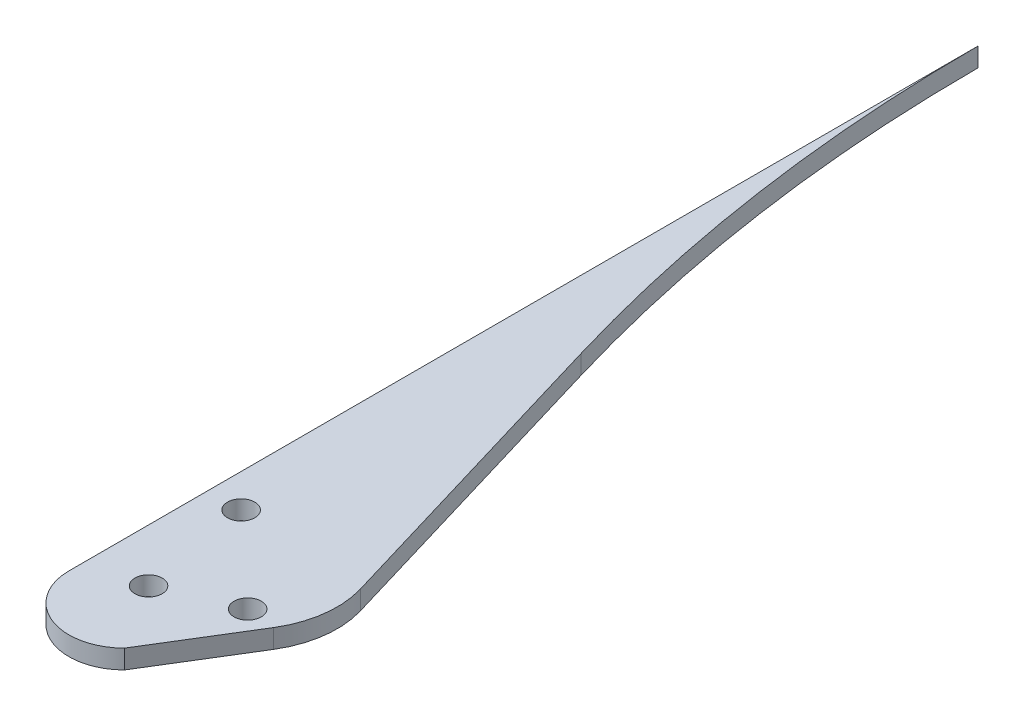
ISO-10303-21;
HEADER;
FILE_DESCRIPTION(('STEP AP214'),'2;1');
FILE_NAME('part.step','',(''),(''),'','','');
FILE_SCHEMA(('AUTOMOTIVE_DESIGN { 1 0 10303 214 1 1 1 1 }'));
ENDSEC;
DATA;
#1=APPLICATION_CONTEXT('core data for automotive mechanical design processes');
#2=APPLICATION_PROTOCOL_DEFINITION('international standard','automotive_design',2000,#1);
#3=PRODUCT_CONTEXT('',#1,'mechanical');
#4=PRODUCT('Part','Part','',(#3));
#5=PRODUCT_RELATED_PRODUCT_CATEGORY('part','',(#4));
#6=PRODUCT_DEFINITION_FORMATION('','',#4);
#7=PRODUCT_DEFINITION_CONTEXT('part definition',#1,'design');
#8=PRODUCT_DEFINITION('design','',#6,#7);
#9=PRODUCT_DEFINITION_SHAPE('','',#8);
#10=(LENGTH_UNIT() NAMED_UNIT(*) SI_UNIT(.MILLI.,.METRE.));
#11=(NAMED_UNIT(*) PLANE_ANGLE_UNIT() SI_UNIT($,.RADIAN.));
#12=(NAMED_UNIT(*) SI_UNIT($,.STERADIAN.) SOLID_ANGLE_UNIT());
#13=UNCERTAINTY_MEASURE_WITH_UNIT(LENGTH_MEASURE(1.E-05),#10,'distance_accuracy_value','');
#14=(GEOMETRIC_REPRESENTATION_CONTEXT(3) GLOBAL_UNCERTAINTY_ASSIGNED_CONTEXT((#13)) GLOBAL_UNIT_ASSIGNED_CONTEXT((#10,
#11,#12)) REPRESENTATION_CONTEXT('',''));
#15=CARTESIAN_POINT('',(0.,0.,0.));
#16=DIRECTION('',(0.,0.,1.));
#17=DIRECTION('',(1.,0.,0.));
#18=AXIS2_PLACEMENT_3D('',#15,#16,#17);
#19=CARTESIAN_POINT('',(545.559709198335,6.35,-304.8));
#20=DIRECTION('',(0.,-1.,0.));
#21=DIRECTION('',(0.,0.,-1.));
#22=AXIS2_PLACEMENT_3D('',#19,#20,#21);
#23=CYLINDRICAL_SURFACE('',#22,545.559709198344);
#24=CARTESIAN_POINT('',(545.559709198335,0.,-304.8));
#25=DIRECTION('',(0.,-1.,0.));
#26=DIRECTION('',(0.,0.,-1.));
#27=AXIS2_PLACEMENT_3D('',#24,#25,#26);
#28=CIRCLE('',#27,545.559709198344);
#29=CARTESIAN_POINT('',(22.7226034286536,0.,-148.989996691602));
#30=VERTEX_POINT('',#29);
#31=CARTESIAN_POINT('',(-1.07275299754406E-11,0.,-304.8));
#32=VERTEX_POINT('',#31);
#33=EDGE_CURVE('E190',#30,#32,#28,.T.);
#34=ORIENTED_EDGE('',*,*,#33,.T.);
#35=DIRECTION('',(0.,-1.,0.));
#36=VECTOR('',#35,1.);
#37=CARTESIAN_POINT('',(-1.07275299754406E-11,6.35,-304.8));
#38=LINE('',#37,#36);
#39=CARTESIAN_POINT('',(0.,6.35,-304.8));
#40=VERTEX_POINT('',#39);
#41=EDGE_CURVE('E12',#40,#32,#38,.T.);
#42=ORIENTED_EDGE('',*,*,#41,.F.);
#43=CARTESIAN_POINT('',(545.559709198335,6.35,-304.8));
#44=DIRECTION('',(0.,-1.,0.));
#45=DIRECTION('',(0.,0.,-1.));
#46=AXIS2_PLACEMENT_3D('',#43,#44,#45);
#47=CIRCLE('',#46,545.559709198344);
#48=CARTESIAN_POINT('',(22.7226034286536,6.35,-148.989996691602));
#49=VERTEX_POINT('',#48);
#50=EDGE_CURVE('E135',#49,#40,#47,.T.);
#51=ORIENTED_EDGE('',*,*,#50,.F.);
#52=DIRECTION('',(0.,-1.,0.));
#53=VECTOR('',#52,1.);
#54=CARTESIAN_POINT('',(22.7226034286536,6.35,-148.989996691602));
#55=LINE('',#54,#53);
#56=EDGE_CURVE('E119',#49,#30,#55,.T.);
#57=ORIENTED_EDGE('',*,*,#56,.T.);
#58=EDGE_LOOP('',(#34,#42,#51,#57));
#59=FACE_BOUND('',#58,.T.);
#60=ADVANCED_FACE('F37',(#59),#23,.F.);
#61=CARTESIAN_POINT('',(0.,6.35,-114.3));
#62=DIRECTION('',(1.,0.,0.));
#63=DIRECTION('',(0.,0.,-1.));
#64=AXIS2_PLACEMENT_3D('',#61,#62,#63);
#65=PLANE('',#64);
#66=DIRECTION('',(0.,0.,1.));
#67=VECTOR('',#66,1.);
#68=CARTESIAN_POINT('',(0.,0.,-114.3));
#69=LINE('',#68,#67);
#70=CARTESIAN_POINT('',(0.,0.,0.));
#71=VERTEX_POINT('',#70);
#72=EDGE_CURVE('E193',#32,#71,#69,.T.);
#73=ORIENTED_EDGE('',*,*,#72,.T.);
#74=DIRECTION('',(0.,-1.,0.));
#75=VECTOR('',#74,1.);
#76=CARTESIAN_POINT('',(0.,6.35,0.));
#77=LINE('',#76,#75);
#78=CARTESIAN_POINT('',(0.,6.35,0.));
#79=VERTEX_POINT('',#78);
#80=EDGE_CURVE('E45',#79,#71,#77,.T.);
#81=ORIENTED_EDGE('',*,*,#80,.F.);
#82=DIRECTION('',(0.,0.,1.));
#83=VECTOR('',#82,1.);
#84=CARTESIAN_POINT('',(0.,6.35,-114.3));
#85=LINE('',#84,#83);
#86=EDGE_CURVE('E90',#40,#79,#85,.T.);
#87=ORIENTED_EDGE('',*,*,#86,.F.);
#88=ORIENTED_EDGE('',*,*,#41,.T.);
#89=EDGE_LOOP('',(#73,#81,#87,#88));
#90=FACE_BOUND('',#89,.T.);
#91=ADVANCED_FACE('F180',(#90),#65,.F.);
#92=CARTESIAN_POINT('',(18.5666089965398,6.35,0.));
#93=DIRECTION('',(0.,-1.,0.));
#94=DIRECTION('',(0.,0.,-1.));
#95=AXIS2_PLACEMENT_3D('',#92,#93,#94);
#96=CYLINDRICAL_SURFACE('',#95,18.5666089965398);
#97=CARTESIAN_POINT('',(18.5666089965398,0.,0.));
#98=DIRECTION('',(0.,1.,0.));
#99=DIRECTION('',(0.,0.,1.));
#100=AXIS2_PLACEMENT_3D('',#97,#98,#99);
#101=CIRCLE('',#100,18.5666089965398);
#102=CARTESIAN_POINT('',(31.75,0.,13.0735294117647));
#103=VERTEX_POINT('',#102);
#104=EDGE_CURVE('E195',#71,#103,#101,.T.);
#105=ORIENTED_EDGE('',*,*,#104,.T.);
#106=DIRECTION('',(0.,-1.,0.));
#107=VECTOR('',#106,1.);
#108=CARTESIAN_POINT('',(31.75,6.35,13.0735294117647));
#109=LINE('',#108,#107);
#110=CARTESIAN_POINT('',(31.75,6.35,13.0735294117647));
#111=VERTEX_POINT('',#110);
#112=EDGE_CURVE('E112',#111,#103,#109,.T.);
#113=ORIENTED_EDGE('',*,*,#112,.F.);
#114=CARTESIAN_POINT('',(18.5666089965398,6.35,0.));
#115=DIRECTION('',(0.,1.,0.));
#116=DIRECTION('',(0.,0.,1.));
#117=AXIS2_PLACEMENT_3D('',#114,#115,#116);
#118=CIRCLE('',#117,18.5666089965398);
#119=EDGE_CURVE('E102',#79,#111,#118,.T.);
#120=ORIENTED_EDGE('',*,*,#119,.F.);
#121=ORIENTED_EDGE('',*,*,#80,.T.);
#122=EDGE_LOOP('',(#105,#113,#120,#121));
#123=FACE_BOUND('',#122,.T.);
#124=ADVANCED_FACE('F185',(#123),#96,.T.);
#125=CARTESIAN_POINT('',(31.75,6.35,13.0735294117647));
#126=DIRECTION('',(-0.852079388461186,0.,-0.523412567445234));
#127=DIRECTION('',(-0.523412567445234,0.,0.852079388461186));
#128=AXIS2_PLACEMENT_3D('',#125,#126,#127);
#129=PLANE('',#128);
#130=DIRECTION('',(0.523412567445234,0.,-0.852079388461186));
#131=VECTOR('',#130,1.);
#132=CARTESIAN_POINT('',(31.75,0.,13.0735294117647));
#133=LINE('',#132,#131);
#134=CARTESIAN_POINT('',(50.7652023278703,0.,-17.8819022663116));
#135=VERTEX_POINT('',#134);
#136=EDGE_CURVE('E111',#103,#135,#133,.T.);
#137=ORIENTED_EDGE('',*,*,#136,.T.);
#138=DIRECTION('',(0.,-1.,0.));
#139=VECTOR('',#138,1.);
#140=CARTESIAN_POINT('',(50.7652023278703,6.35,-17.8819022663116));
#141=LINE('',#140,#139);
#142=CARTESIAN_POINT('',(50.7652023278703,6.35,-17.8819022663116));
#143=VERTEX_POINT('',#142);
#144=EDGE_CURVE('E108',#143,#135,#141,.T.);
#145=ORIENTED_EDGE('',*,*,#144,.F.);
#146=DIRECTION('',(0.523412567445234,0.,-0.852079388461186));
#147=VECTOR('',#146,1.);
#148=CARTESIAN_POINT('',(31.75,6.35,13.0735294117647));
#149=LINE('',#148,#147);
#150=EDGE_CURVE('E96',#111,#143,#149,.T.);
#151=ORIENTED_EDGE('',*,*,#150,.F.);
#152=ORIENTED_EDGE('',*,*,#112,.T.);
#153=EDGE_LOOP('',(#137,#145,#151,#152));
#154=FACE_BOUND('',#153,.T.);
#155=ADVANCED_FACE('F109',(#154),#129,.F.);
#156=CARTESIAN_POINT('',(23.7116817442277,6.35,-34.5002512826978));
#157=DIRECTION('',(0.,-1.,0.));
#158=DIRECTION('',(0.,0.,-1.));
#159=AXIS2_PLACEMENT_3D('',#156,#157,#158);
#160=CYLINDRICAL_SURFACE('',#159,31.75);
#161=CARTESIAN_POINT('',(23.7116817442277,0.,-34.5002512826978));
#162=DIRECTION('',(0.,1.,0.));
#163=DIRECTION('',(0.,0.,1.));
#164=AXIS2_PLACEMENT_3D('',#161,#162,#163);
#165=CIRCLE('',#164,31.75);
#166=CARTESIAN_POINT('',(54.1392918266872,0.,-43.5679436390698));
#167=VERTEX_POINT('',#166);
#168=EDGE_CURVE('E77',#135,#167,#165,.T.);
#169=ORIENTED_EDGE('',*,*,#168,.T.);
#170=DIRECTION('',(0.,-1.,0.));
#171=VECTOR('',#170,1.);
#172=CARTESIAN_POINT('',(54.1392918266872,6.35,-43.5679436390698));
#173=LINE('',#172,#171);
#174=CARTESIAN_POINT('',(54.1392918266872,6.35,-43.5679436390698));
#175=VERTEX_POINT('',#174);
#176=EDGE_CURVE('E113',#175,#167,#173,.T.);
#177=ORIENTED_EDGE('',*,*,#176,.F.);
#178=CARTESIAN_POINT('',(23.7116817442277,6.35,-34.5002512826978));
#179=DIRECTION('',(0.,1.,0.));
#180=DIRECTION('',(0.,0.,1.));
#181=AXIS2_PLACEMENT_3D('',#178,#179,#180);
#182=CIRCLE('',#181,31.75);
#183=EDGE_CURVE('E100',#143,#175,#182,.T.);
#184=ORIENTED_EDGE('',*,*,#183,.F.);
#185=ORIENTED_EDGE('',*,*,#144,.T.);
#186=EDGE_LOOP('',(#169,#177,#184,#185));
#187=FACE_BOUND('',#186,.T.);
#188=ADVANCED_FACE('F115',(#187),#160,.T.);
#189=CARTESIAN_POINT('',(54.1392918266872,6.35,-43.5679436390698));
#190=DIRECTION('',(-0.958349923856993,0.,0.285596609649513));
#191=DIRECTION('',(0.285596609649513,0.,0.958349923856993));
#192=AXIS2_PLACEMENT_3D('',#189,#190,#191);
#193=PLANE('',#192);
#194=DIRECTION('',(-0.285596609649513,0.,-0.958349923856993));
#195=VECTOR('',#194,1.);
#196=CARTESIAN_POINT('',(54.1392918266872,0.,-43.5679436390698));
#197=LINE('',#196,#195);
#198=EDGE_CURVE('E83',#167,#30,#197,.T.);
#199=ORIENTED_EDGE('',*,*,#198,.T.);
#200=ORIENTED_EDGE('',*,*,#56,.F.);
#201=DIRECTION('',(-0.285596609649513,0.,-0.958349923856993));
#202=VECTOR('',#201,1.);
#203=CARTESIAN_POINT('',(54.1392918266872,6.35,-43.5679436390698));
#204=LINE('',#203,#202);
#205=EDGE_CURVE('E53',#175,#49,#204,.T.);
#206=ORIENTED_EDGE('',*,*,#205,.F.);
#207=ORIENTED_EDGE('',*,*,#176,.T.);
#208=EDGE_LOOP('',(#199,#200,#206,#207));
#209=FACE_BOUND('',#208,.T.);
#210=ADVANCED_FACE('F165',(#209),#193,.F.);
#211=CARTESIAN_POINT('',(545.559709198335,6.35,-304.8));
#212=DIRECTION('',(0.,-1.,0.));
#213=DIRECTION('',(0.,0.,-1.));
#214=AXIS2_PLACEMENT_3D('',#211,#212,#213);
#215=PLANE('',#214);
#216=CARTESIAN_POINT('',(11.1781808712527,6.35,-46.5763109177071));
#217=DIRECTION('',(0.,1.,0.));
#218=DIRECTION('',(0.,0.,1.));
#219=AXIS2_PLACEMENT_3D('',#216,#217,#218);
#220=CIRCLE('',#219,4.57200000000008);
#221=CARTESIAN_POINT('',(11.1781808712527,6.35,-42.004310917707));
#222=VERTEX_POINT('',#221);
#223=EDGE_CURVE('E198',#222,#222,#220,.T.);
#224=ORIENTED_EDGE('',*,*,#223,.F.);
#225=EDGE_LOOP('',(#224));
#226=FACE_BOUND('',#225,.T.);
#227=CARTESIAN_POINT('',(17.7079179818787,6.35,-9.00599211309707));
#228=DIRECTION('',(0.,1.,0.));
#229=DIRECTION('',(0.,0.,1.));
#230=AXIS2_PLACEMENT_3D('',#227,#228,#229);
#231=CIRCLE('',#230,4.57200000000008);
#232=CARTESIAN_POINT('',(17.7079179818787,6.35,-4.433992113097));
#233=VERTEX_POINT('',#232);
#234=EDGE_CURVE('E147',#233,#233,#231,.T.);
#235=ORIENTED_EDGE('',*,*,#234,.F.);
#236=EDGE_LOOP('',(#235));
#237=FACE_BOUND('',#236,.T.);
#238=CARTESIAN_POINT('',(41.0379900090224,6.35,-18.9004864672668));
#239=DIRECTION('',(0.,1.,0.));
#240=DIRECTION('',(0.,0.,1.));
#241=AXIS2_PLACEMENT_3D('',#238,#239,#240);
#242=CIRCLE('',#241,4.57200000000008);
#243=CARTESIAN_POINT('',(41.0379900090224,6.35,-14.3284864672667));
#244=VERTEX_POINT('',#243);
#245=EDGE_CURVE('E139',#244,#244,#242,.T.);
#246=ORIENTED_EDGE('',*,*,#245,.F.);
#247=EDGE_LOOP('',(#246));
#248=FACE_BOUND('',#247,.T.);
#249=ORIENTED_EDGE('',*,*,#50,.T.);
#250=ORIENTED_EDGE('',*,*,#86,.T.);
#251=ORIENTED_EDGE('',*,*,#119,.T.);
#252=ORIENTED_EDGE('',*,*,#150,.T.);
#253=ORIENTED_EDGE('',*,*,#183,.T.);
#254=ORIENTED_EDGE('',*,*,#205,.T.);
#255=EDGE_LOOP('',(#249,#250,#251,#252,#253,#254));
#256=FACE_BOUND('',#255,.T.);
#257=ADVANCED_FACE('F98',(#226,#237,#248,#256),#215,.F.);
#258=CARTESIAN_POINT('',(545.559709198335,0.,-304.8));
#259=DIRECTION('',(0.,-1.,0.));
#260=DIRECTION('',(0.,0.,-1.));
#261=AXIS2_PLACEMENT_3D('',#258,#259,#260);
#262=PLANE('',#261);
#263=CARTESIAN_POINT('',(11.1781808712527,0.,-46.5763109177071));
#264=DIRECTION('',(0.,1.,0.));
#265=DIRECTION('',(0.,0.,1.));
#266=AXIS2_PLACEMENT_3D('',#263,#264,#265);
#267=CIRCLE('',#266,4.57200000000008);
#268=CARTESIAN_POINT('',(11.1781808712527,0.,-42.004310917707));
#269=VERTEX_POINT('',#268);
#270=EDGE_CURVE('E194',#269,#269,#267,.T.);
#271=ORIENTED_EDGE('',*,*,#270,.T.);
#272=EDGE_LOOP('',(#271));
#273=FACE_BOUND('',#272,.T.);
#274=CARTESIAN_POINT('',(17.7079179818787,0.,-9.00599211309707));
#275=DIRECTION('',(0.,1.,0.));
#276=DIRECTION('',(0.,0.,1.));
#277=AXIS2_PLACEMENT_3D('',#274,#275,#276);
#278=CIRCLE('',#277,4.57200000000008);
#279=CARTESIAN_POINT('',(17.7079179818787,0.,-4.433992113097));
#280=VERTEX_POINT('',#279);
#281=EDGE_CURVE('E152',#280,#280,#278,.T.);
#282=ORIENTED_EDGE('',*,*,#281,.T.);
#283=EDGE_LOOP('',(#282));
#284=FACE_BOUND('',#283,.T.);
#285=CARTESIAN_POINT('',(41.0379900090224,0.,-18.9004864672668));
#286=DIRECTION('',(0.,1.,0.));
#287=DIRECTION('',(0.,0.,1.));
#288=AXIS2_PLACEMENT_3D('',#285,#286,#287);
#289=CIRCLE('',#288,4.57200000000008);
#290=CARTESIAN_POINT('',(41.0379900090224,0.,-14.3284864672667));
#291=VERTEX_POINT('',#290);
#292=EDGE_CURVE('E153',#291,#291,#289,.T.);
#293=ORIENTED_EDGE('',*,*,#292,.T.);
#294=EDGE_LOOP('',(#293));
#295=FACE_BOUND('',#294,.T.);
#296=ORIENTED_EDGE('',*,*,#72,.F.);
#297=ORIENTED_EDGE('',*,*,#33,.F.);
#298=ORIENTED_EDGE('',*,*,#198,.F.);
#299=ORIENTED_EDGE('',*,*,#168,.F.);
#300=ORIENTED_EDGE('',*,*,#136,.F.);
#301=ORIENTED_EDGE('',*,*,#104,.F.);
#302=EDGE_LOOP('',(#296,#297,#298,#299,#300,#301));
#303=FACE_BOUND('',#302,.T.);
#304=ADVANCED_FACE('F164',(#273,#284,#295,#303),#262,.T.);
#305=CARTESIAN_POINT('',(41.0379900090224,0.,-18.9004864672668));
#306=DIRECTION('',(0.,1.,0.));
#307=DIRECTION('',(0.,0.,1.));
#308=AXIS2_PLACEMENT_3D('',#305,#306,#307);
#309=CYLINDRICAL_SURFACE('',#308,4.57200000000008);
#310=ORIENTED_EDGE('',*,*,#292,.F.);
#311=EDGE_LOOP('',(#310));
#312=FACE_BOUND('',#311,.T.);
#313=ORIENTED_EDGE('',*,*,#245,.T.);
#314=EDGE_LOOP('',(#313));
#315=FACE_BOUND('',#314,.T.);
#316=ADVANCED_FACE('F161',(#312,#315),#309,.F.);
#317=CARTESIAN_POINT('',(17.7079179818787,0.,-9.00599211309707));
#318=DIRECTION('',(0.,1.,0.));
#319=DIRECTION('',(0.,0.,1.));
#320=AXIS2_PLACEMENT_3D('',#317,#318,#319);
#321=CYLINDRICAL_SURFACE('',#320,4.57200000000008);
#322=ORIENTED_EDGE('',*,*,#281,.F.);
#323=EDGE_LOOP('',(#322));
#324=FACE_BOUND('',#323,.T.);
#325=ORIENTED_EDGE('',*,*,#234,.T.);
#326=EDGE_LOOP('',(#325));
#327=FACE_BOUND('',#326,.T.);
#328=ADVANCED_FACE('F243',(#324,#327),#321,.F.);
#329=CARTESIAN_POINT('',(11.1781808712527,0.,-46.5763109177071));
#330=DIRECTION('',(0.,1.,0.));
#331=DIRECTION('',(0.,0.,1.));
#332=AXIS2_PLACEMENT_3D('',#329,#330,#331);
#333=CYLINDRICAL_SURFACE('',#332,4.57200000000008);
#334=ORIENTED_EDGE('',*,*,#270,.F.);
#335=EDGE_LOOP('',(#334));
#336=FACE_BOUND('',#335,.T.);
#337=ORIENTED_EDGE('',*,*,#223,.T.);
#338=EDGE_LOOP('',(#337));
#339=FACE_BOUND('',#338,.T.);
#340=ADVANCED_FACE('F250',(#336,#339),#333,.F.);
#341=CLOSED_SHELL('',(#60,#91,#124,#155,#188,#210,#257,#304,#316,#328,#340));
#342=MANIFOLD_SOLID_BREP('B2',#341);
#343=ADVANCED_BREP_SHAPE_REPRESENTATION('',(#18,#342),#14);
#344=SHAPE_DEFINITION_REPRESENTATION(#9,#343);
ENDSEC;
END-ISO-10303-21;
